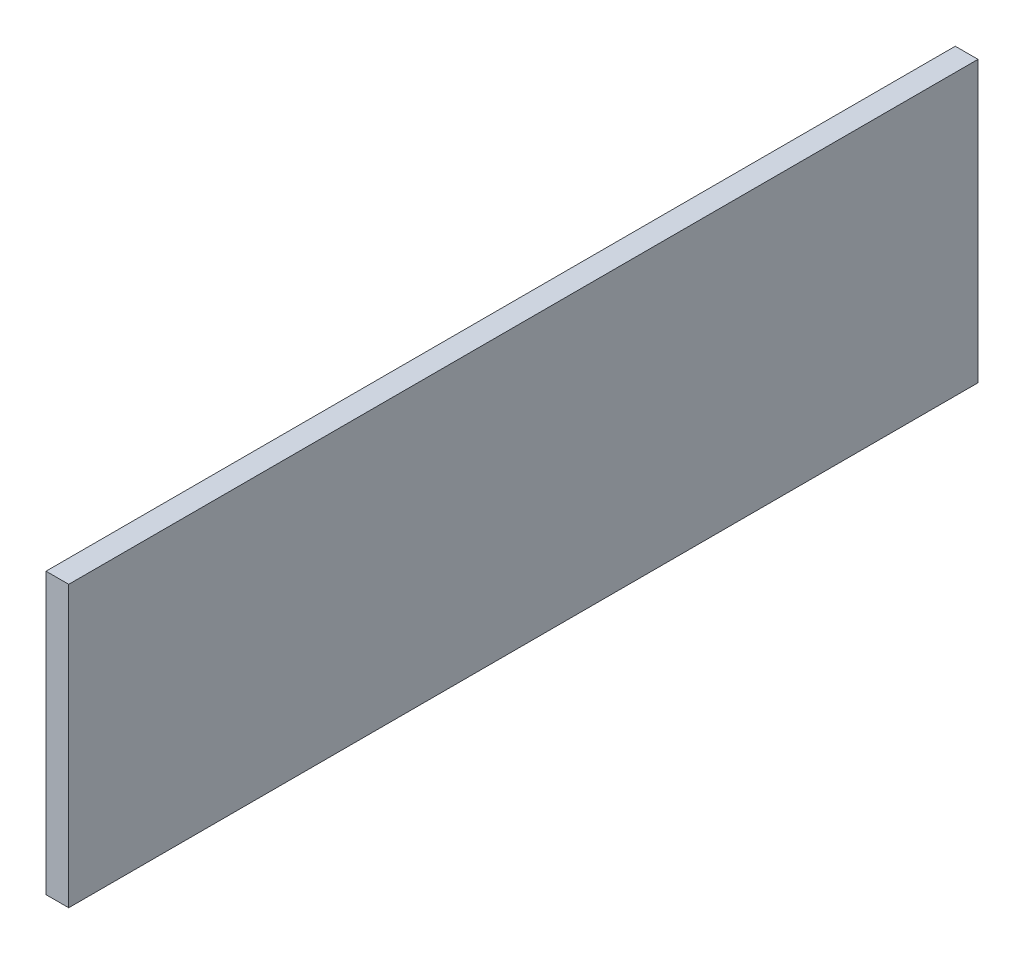
ISO-10303-21;
HEADER;
FILE_DESCRIPTION(('STEP AP214'),'2;1');
FILE_NAME('part.step','',(''),(''),'','','');
FILE_SCHEMA(('AUTOMOTIVE_DESIGN { 1 0 10303 214 1 1 1 1 }'));
ENDSEC;
DATA;
#1=APPLICATION_CONTEXT('core data for automotive mechanical design processes');
#2=APPLICATION_PROTOCOL_DEFINITION('international standard','automotive_design',2000,#1);
#3=PRODUCT_CONTEXT('',#1,'mechanical');
#4=PRODUCT('Part','Part','',(#3));
#5=PRODUCT_RELATED_PRODUCT_CATEGORY('part','',(#4));
#6=PRODUCT_DEFINITION_FORMATION('','',#4);
#7=PRODUCT_DEFINITION_CONTEXT('part definition',#1,'design');
#8=PRODUCT_DEFINITION('design','',#6,#7);
#9=PRODUCT_DEFINITION_SHAPE('','',#8);
#10=(LENGTH_UNIT() NAMED_UNIT(*) SI_UNIT(.MILLI.,.METRE.));
#11=(NAMED_UNIT(*) PLANE_ANGLE_UNIT() SI_UNIT($,.RADIAN.));
#12=(NAMED_UNIT(*) SI_UNIT($,.STERADIAN.) SOLID_ANGLE_UNIT());
#13=UNCERTAINTY_MEASURE_WITH_UNIT(LENGTH_MEASURE(1.E-05),#10,'distance_accuracy_value','');
#14=(GEOMETRIC_REPRESENTATION_CONTEXT(3) GLOBAL_UNCERTAINTY_ASSIGNED_CONTEXT((#13)) GLOBAL_UNIT_ASSIGNED_CONTEXT((#10,
#11,#12)) REPRESENTATION_CONTEXT('',''));
#15=CARTESIAN_POINT('',(0.,0.,0.));
#16=DIRECTION('',(0.,0.,1.));
#17=DIRECTION('',(1.,0.,0.));
#18=AXIS2_PLACEMENT_3D('',#15,#16,#17);
#19=CARTESIAN_POINT('',(-76.9833333333334,0.,381.25));
#20=DIRECTION('',(1.,0.,0.));
#21=DIRECTION('',(0.,0.,-1.));
#22=AXIS2_PLACEMENT_3D('',#19,#20,#21);
#23=PLANE('',#22);
#24=DIRECTION('',(0.,-1.,0.));
#25=VECTOR('',#24,1.);
#26=CARTESIAN_POINT('',(-76.9833333333334,0.,0.));
#27=LINE('',#26,#25);
#28=CARTESIAN_POINT('',(-76.9833333333334,490.475,0.));
#29=VERTEX_POINT('',#28);
#30=CARTESIAN_POINT('',(-76.9833333333334,373.016666666667,0.));
#31=VERTEX_POINT('',#30);
#32=EDGE_CURVE('E108',#29,#31,#27,.T.);
#33=ORIENTED_EDGE('',*,*,#32,.F.);
#34=DIRECTION('',(0.,0.,-1.));
#35=VECTOR('',#34,1.);
#36=CARTESIAN_POINT('',(-76.9833333333334,490.475,381.25));
#37=LINE('',#36,#35);
#38=CARTESIAN_POINT('',(-76.9833333333334,490.475,381.25));
#39=VERTEX_POINT('',#38);
#40=EDGE_CURVE('E11',#39,#29,#37,.T.);
#41=ORIENTED_EDGE('',*,*,#40,.F.);
#42=DIRECTION('',(0.,-1.,0.));
#43=VECTOR('',#42,1.);
#44=CARTESIAN_POINT('',(-76.9833333333334,0.,381.25));
#45=LINE('',#44,#43);
#46=CARTESIAN_POINT('',(-76.9833333333334,373.016666666667,381.25));
#47=VERTEX_POINT('',#46);
#48=EDGE_CURVE('E102',#39,#47,#45,.T.);
#49=ORIENTED_EDGE('',*,*,#48,.T.);
#50=DIRECTION('',(0.,0.,-1.));
#51=VECTOR('',#50,1.);
#52=CARTESIAN_POINT('',(-76.9833333333334,373.016666666667,381.25));
#53=LINE('',#52,#51);
#54=EDGE_CURVE('E83',#47,#31,#53,.T.);
#55=ORIENTED_EDGE('',*,*,#54,.T.);
#56=EDGE_LOOP('',(#33,#41,#49,#55));
#57=FACE_BOUND('',#56,.T.);
#58=ADVANCED_FACE('F45',(#57),#23,.T.);
#59=CARTESIAN_POINT('',(0.,490.475,381.25));
#60=DIRECTION('',(0.,1.,0.));
#61=DIRECTION('',(0.,0.,1.));
#62=AXIS2_PLACEMENT_3D('',#59,#60,#61);
#63=PLANE('',#62);
#64=DIRECTION('',(1.,0.,0.));
#65=VECTOR('',#64,1.);
#66=CARTESIAN_POINT('',(0.,490.475,0.));
#67=LINE('',#66,#65);
#68=CARTESIAN_POINT('',(-86.5083333333334,490.475,0.));
#69=VERTEX_POINT('',#68);
#70=EDGE_CURVE('E96',#69,#29,#67,.T.);
#71=ORIENTED_EDGE('',*,*,#70,.F.);
#72=DIRECTION('',(0.,0.,-1.));
#73=VECTOR('',#72,1.);
#74=CARTESIAN_POINT('',(-86.5083333333334,490.475,381.25));
#75=LINE('',#74,#73);
#76=CARTESIAN_POINT('',(-86.5083333333334,490.475,381.25));
#77=VERTEX_POINT('',#76);
#78=EDGE_CURVE('E53',#77,#69,#75,.T.);
#79=ORIENTED_EDGE('',*,*,#78,.F.);
#80=DIRECTION('',(1.,0.,0.));
#81=VECTOR('',#80,1.);
#82=CARTESIAN_POINT('',(0.,490.475,381.25));
#83=LINE('',#82,#81);
#84=EDGE_CURVE('E94',#77,#39,#83,.T.);
#85=ORIENTED_EDGE('',*,*,#84,.T.);
#86=ORIENTED_EDGE('',*,*,#40,.T.);
#87=EDGE_LOOP('',(#71,#79,#85,#86));
#88=FACE_BOUND('',#87,.T.);
#89=ADVANCED_FACE('F92',(#88),#63,.T.);
#90=CARTESIAN_POINT('',(-86.5083333333334,0.,381.25));
#91=DIRECTION('',(1.,0.,0.));
#92=DIRECTION('',(0.,0.,-1.));
#93=AXIS2_PLACEMENT_3D('',#90,#91,#92);
#94=PLANE('',#93);
#95=DIRECTION('',(0.,-1.,0.));
#96=VECTOR('',#95,1.);
#97=CARTESIAN_POINT('',(-86.5083333333334,0.,0.));
#98=LINE('',#97,#96);
#99=CARTESIAN_POINT('',(-86.5083333333334,373.016666666667,0.));
#100=VERTEX_POINT('',#99);
#101=EDGE_CURVE('E76',#69,#100,#98,.T.);
#102=ORIENTED_EDGE('',*,*,#101,.T.);
#103=DIRECTION('',(0.,0.,-1.));
#104=VECTOR('',#103,1.);
#105=CARTESIAN_POINT('',(-86.5083333333334,373.016666666667,381.25));
#106=LINE('',#105,#104);
#107=CARTESIAN_POINT('',(-86.5083333333334,373.016666666667,381.25));
#108=VERTEX_POINT('',#107);
#109=EDGE_CURVE('E97',#108,#100,#106,.T.);
#110=ORIENTED_EDGE('',*,*,#109,.F.);
#111=DIRECTION('',(0.,-1.,0.));
#112=VECTOR('',#111,1.);
#113=CARTESIAN_POINT('',(-86.5083333333334,0.,381.25));
#114=LINE('',#113,#112);
#115=EDGE_CURVE('E98',#77,#108,#114,.T.);
#116=ORIENTED_EDGE('',*,*,#115,.F.);
#117=ORIENTED_EDGE('',*,*,#78,.T.);
#118=EDGE_LOOP('',(#102,#110,#116,#117));
#119=FACE_BOUND('',#118,.T.);
#120=ADVANCED_FACE('F99',(#119),#94,.F.);
#121=CARTESIAN_POINT('',(1.03328418813331E-12,373.016666666666,381.25));
#122=DIRECTION('',(0.,1.,0.));
#123=DIRECTION('',(-1.,0.,0.));
#124=AXIS2_PLACEMENT_3D('',#121,#122,#123);
#125=PLANE('',#124);
#126=DIRECTION('',(1.,0.,0.));
#127=VECTOR('',#126,1.);
#128=CARTESIAN_POINT('',(1.03328418813331E-12,373.016666666666,0.));
#129=LINE('',#128,#127);
#130=EDGE_CURVE('E104',#100,#31,#129,.T.);
#131=ORIENTED_EDGE('',*,*,#130,.T.);
#132=ORIENTED_EDGE('',*,*,#54,.F.);
#133=DIRECTION('',(1.,0.,0.));
#134=VECTOR('',#133,1.);
#135=CARTESIAN_POINT('',(1.03328418813331E-12,373.016666666666,381.25));
#136=LINE('',#135,#134);
#137=EDGE_CURVE('E61',#108,#47,#136,.T.);
#138=ORIENTED_EDGE('',*,*,#137,.F.);
#139=ORIENTED_EDGE('',*,*,#109,.T.);
#140=EDGE_LOOP('',(#131,#132,#138,#139));
#141=FACE_BOUND('',#140,.T.);
#142=ADVANCED_FACE('F117',(#141),#125,.F.);
#143=CARTESIAN_POINT('',(0.,0.,381.25));
#144=DIRECTION('',(0.,0.,1.));
#145=DIRECTION('',(1.,0.,0.));
#146=AXIS2_PLACEMENT_3D('',#143,#144,#145);
#147=PLANE('',#146);
#148=ORIENTED_EDGE('',*,*,#48,.F.);
#149=ORIENTED_EDGE('',*,*,#84,.F.);
#150=ORIENTED_EDGE('',*,*,#115,.T.);
#151=ORIENTED_EDGE('',*,*,#137,.T.);
#152=EDGE_LOOP('',(#148,#149,#150,#151));
#153=FACE_BOUND('',#152,.T.);
#154=ADVANCED_FACE('F101',(#153),#147,.T.);
#155=CARTESIAN_POINT('',(0.,0.,0.));
#156=DIRECTION('',(0.,0.,1.));
#157=DIRECTION('',(1.,0.,0.));
#158=AXIS2_PLACEMENT_3D('',#155,#156,#157);
#159=PLANE('',#158);
#160=ORIENTED_EDGE('',*,*,#32,.T.);
#161=ORIENTED_EDGE('',*,*,#130,.F.);
#162=ORIENTED_EDGE('',*,*,#101,.F.);
#163=ORIENTED_EDGE('',*,*,#70,.T.);
#164=EDGE_LOOP('',(#160,#161,#162,#163));
#165=FACE_BOUND('',#164,.T.);
#166=ADVANCED_FACE('F119',(#165),#159,.F.);
#167=CLOSED_SHELL('',(#58,#89,#120,#142,#154,#166));
#168=MANIFOLD_SOLID_BREP('B2',#167);
#169=ADVANCED_BREP_SHAPE_REPRESENTATION('',(#18,#168),#14);
#170=SHAPE_DEFINITION_REPRESENTATION(#9,#169);
ENDSEC;
END-ISO-10303-21;
